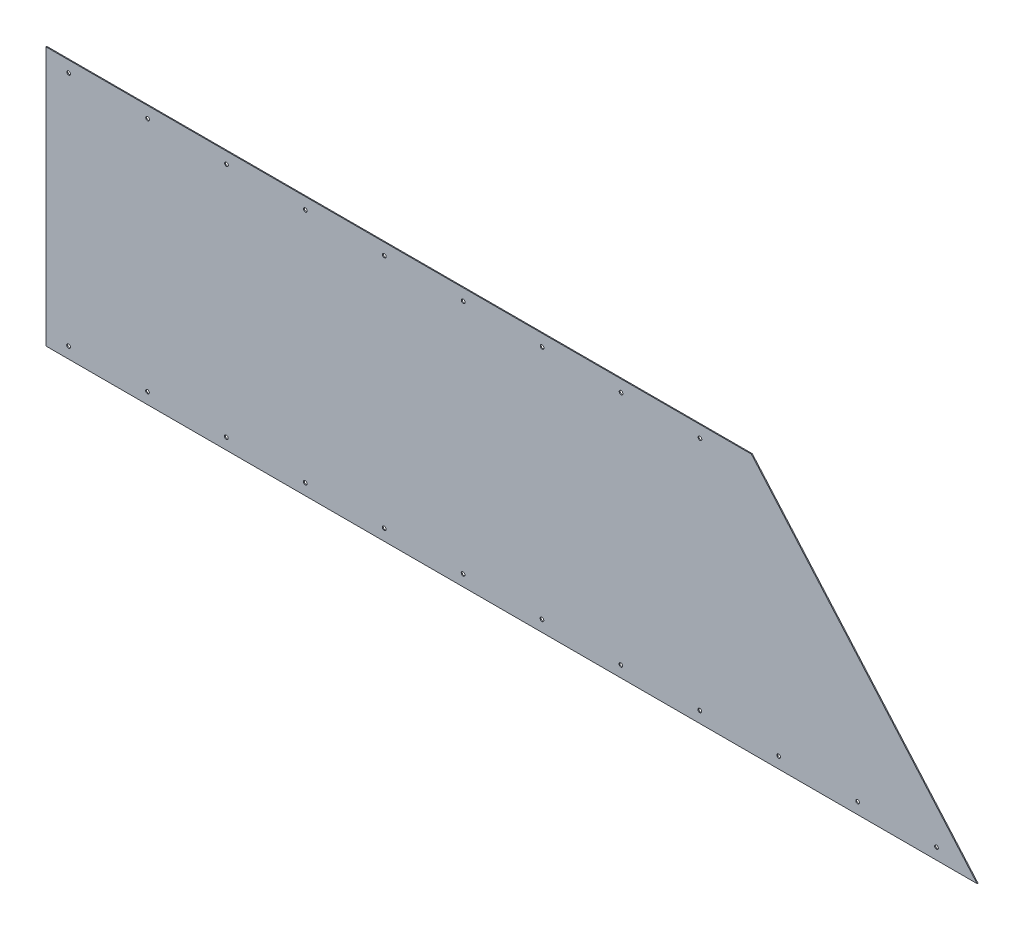
ISO-10303-21;
HEADER;
FILE_DESCRIPTION(('STEP AP214'),'2;1');
FILE_NAME('part.step','',(''),(''),'','','');
FILE_SCHEMA(('AUTOMOTIVE_DESIGN { 1 0 10303 214 1 1 1 1 }'));
ENDSEC;
DATA;
#1=APPLICATION_CONTEXT('core data for automotive mechanical design processes');
#2=APPLICATION_PROTOCOL_DEFINITION('international standard','automotive_design',2000,#1);
#3=PRODUCT_CONTEXT('',#1,'mechanical');
#4=PRODUCT('Part','Part','',(#3));
#5=PRODUCT_RELATED_PRODUCT_CATEGORY('part','',(#4));
#6=PRODUCT_DEFINITION_FORMATION('','',#4);
#7=PRODUCT_DEFINITION_CONTEXT('part definition',#1,'design');
#8=PRODUCT_DEFINITION('design','',#6,#7);
#9=PRODUCT_DEFINITION_SHAPE('','',#8);
#10=(LENGTH_UNIT() NAMED_UNIT(*) SI_UNIT(.MILLI.,.METRE.));
#11=(NAMED_UNIT(*) PLANE_ANGLE_UNIT() SI_UNIT($,.RADIAN.));
#12=(NAMED_UNIT(*) SI_UNIT($,.STERADIAN.) SOLID_ANGLE_UNIT());
#13=UNCERTAINTY_MEASURE_WITH_UNIT(LENGTH_MEASURE(1.E-05),#10,'distance_accuracy_value','');
#14=(GEOMETRIC_REPRESENTATION_CONTEXT(3) GLOBAL_UNCERTAINTY_ASSIGNED_CONTEXT((#13)) GLOBAL_UNIT_ASSIGNED_CONTEXT((#10,
#11,#12)) REPRESENTATION_CONTEXT('',''));
#15=CARTESIAN_POINT('',(0.,0.,0.));
#16=DIRECTION('',(0.,0.,1.));
#17=DIRECTION('',(1.,0.,0.));
#18=AXIS2_PLACEMENT_3D('',#15,#16,#17);
#19=CARTESIAN_POINT('',(-827.22,-229.645,-1.5875));
#20=DIRECTION('',(-1.,0.,0.));
#21=DIRECTION('',(0.,0.,1.));
#22=AXIS2_PLACEMENT_3D('',#19,#20,#21);
#23=PLANE('',#22);
#24=DIRECTION('',(0.,-1.,0.));
#25=VECTOR('',#24,1.);
#26=CARTESIAN_POINT('',(-827.22,-229.645,0.));
#27=LINE('',#26,#25);
#28=CARTESIAN_POINT('',(-827.22,230.125,0.));
#29=VERTEX_POINT('',#28);
#30=CARTESIAN_POINT('',(-827.22,-229.645,0.));
#31=VERTEX_POINT('',#30);
#32=EDGE_CURVE('E105',#29,#31,#27,.T.);
#33=ORIENTED_EDGE('',*,*,#32,.F.);
#34=DIRECTION('',(0.,0.,1.));
#35=VECTOR('',#34,1.);
#36=CARTESIAN_POINT('',(-827.22,230.125,-1.5875));
#37=LINE('',#36,#35);
#38=CARTESIAN_POINT('',(-827.22,230.125,-1.5875));
#39=VERTEX_POINT('',#38);
#40=EDGE_CURVE('E11',#39,#29,#37,.T.);
#41=ORIENTED_EDGE('',*,*,#40,.F.);
#42=DIRECTION('',(0.,-1.,0.));
#43=VECTOR('',#42,1.);
#44=CARTESIAN_POINT('',(-827.22,-229.645,-1.5875));
#45=LINE('',#44,#43);
#46=CARTESIAN_POINT('',(-827.22,-229.645,-1.5875));
#47=VERTEX_POINT('',#46);
#48=EDGE_CURVE('E98',#39,#47,#45,.T.);
#49=ORIENTED_EDGE('',*,*,#48,.T.);
#50=DIRECTION('',(0.,0.,1.));
#51=VECTOR('',#50,1.);
#52=CARTESIAN_POINT('',(-827.22,-229.645,-1.5875));
#53=LINE('',#52,#51);
#54=EDGE_CURVE('E43',#47,#31,#53,.T.);
#55=ORIENTED_EDGE('',*,*,#54,.T.);
#56=EDGE_LOOP('',(#33,#41,#49,#55));
#57=FACE_BOUND('',#56,.T.);
#58=ADVANCED_FACE('F40',(#57),#23,.T.);
#59=CARTESIAN_POINT('',(-827.22,230.125,-1.5875));
#60=DIRECTION('',(0.,1.,0.));
#61=DIRECTION('',(0.,0.,1.));
#62=AXIS2_PLACEMENT_3D('',#59,#60,#61);
#63=PLANE('',#62);
#64=DIRECTION('',(-1.,0.,0.));
#65=VECTOR('',#64,1.);
#66=CARTESIAN_POINT('',(-827.22,230.125,0.));
#67=LINE('',#66,#65);
#68=CARTESIAN_POINT('',(424.28,230.125,0.));
#69=VERTEX_POINT('',#68);
#70=EDGE_CURVE('E100',#69,#29,#67,.T.);
#71=ORIENTED_EDGE('',*,*,#70,.F.);
#72=DIRECTION('',(0.,0.,1.));
#73=VECTOR('',#72,1.);
#74=CARTESIAN_POINT('',(424.28,230.125,-1.5875));
#75=LINE('',#74,#73);
#76=CARTESIAN_POINT('',(424.28,230.125,-1.5875));
#77=VERTEX_POINT('',#76);
#78=EDGE_CURVE('E49',#77,#69,#75,.T.);
#79=ORIENTED_EDGE('',*,*,#78,.F.);
#80=DIRECTION('',(-1.,0.,0.));
#81=VECTOR('',#80,1.);
#82=CARTESIAN_POINT('',(-827.22,230.125,-1.5875));
#83=LINE('',#82,#81);
#84=EDGE_CURVE('E95',#77,#39,#83,.T.);
#85=ORIENTED_EDGE('',*,*,#84,.T.);
#86=ORIENTED_EDGE('',*,*,#40,.T.);
#87=EDGE_LOOP('',(#71,#79,#85,#86));
#88=FACE_BOUND('',#87,.T.);
#89=ADVANCED_FACE('F116',(#88),#63,.T.);
#90=CARTESIAN_POINT('',(424.28,230.125,-1.5875));
#91=DIRECTION('',(0.754036789276716,0.656832185887127,0.));
#92=DIRECTION('',(-0.656832185887127,0.754036789276716,0.));
#93=AXIS2_PLACEMENT_3D('',#90,#91,#92);
#94=PLANE('',#93);
#95=DIRECTION('',(-0.656832185887127,0.754036789276716,0.));
#96=VECTOR('',#95,1.);
#97=CARTESIAN_POINT('',(424.28,230.125,0.));
#98=LINE('',#97,#96);
#99=CARTESIAN_POINT('',(824.78,-229.645,0.));
#100=VERTEX_POINT('',#99);
#101=EDGE_CURVE('E90',#100,#69,#98,.T.);
#102=ORIENTED_EDGE('',*,*,#101,.F.);
#103=DIRECTION('',(0.,0.,1.));
#104=VECTOR('',#103,1.);
#105=CARTESIAN_POINT('',(824.78,-229.645,-1.5875));
#106=LINE('',#105,#104);
#107=CARTESIAN_POINT('',(824.78,-229.645,-1.5875));
#108=VERTEX_POINT('',#107);
#109=EDGE_CURVE('E85',#108,#100,#106,.T.);
#110=ORIENTED_EDGE('',*,*,#109,.F.);
#111=DIRECTION('',(-0.656832185887127,0.754036789276716,0.));
#112=VECTOR('',#111,1.);
#113=CARTESIAN_POINT('',(424.28,230.125,-1.5875));
#114=LINE('',#113,#112);
#115=EDGE_CURVE('E88',#108,#77,#114,.T.);
#116=ORIENTED_EDGE('',*,*,#115,.T.);
#117=ORIENTED_EDGE('',*,*,#78,.T.);
#118=EDGE_LOOP('',(#102,#110,#116,#117));
#119=FACE_BOUND('',#118,.T.);
#120=ADVANCED_FACE('F87',(#119),#94,.T.);
#121=CARTESIAN_POINT('',(-827.22,-229.645,-1.5875));
#122=DIRECTION('',(0.,-1.,0.));
#123=DIRECTION('',(0.,0.,-1.));
#124=AXIS2_PLACEMENT_3D('',#121,#122,#123);
#125=PLANE('',#124);
#126=DIRECTION('',(1.,0.,0.));
#127=VECTOR('',#126,1.);
#128=CARTESIAN_POINT('',(-827.22,-229.645,0.));
#129=LINE('',#128,#127);
#130=EDGE_CURVE('E108',#31,#100,#129,.T.);
#131=ORIENTED_EDGE('',*,*,#130,.F.);
#132=ORIENTED_EDGE('',*,*,#54,.F.);
#133=DIRECTION('',(1.,0.,0.));
#134=VECTOR('',#133,1.);
#135=CARTESIAN_POINT('',(-827.22,-229.645,-1.5875));
#136=LINE('',#135,#134);
#137=EDGE_CURVE('E94',#47,#108,#136,.T.);
#138=ORIENTED_EDGE('',*,*,#137,.T.);
#139=ORIENTED_EDGE('',*,*,#109,.T.);
#140=EDGE_LOOP('',(#131,#132,#138,#139));
#141=FACE_BOUND('',#140,.T.);
#142=ADVANCED_FACE('F97',(#141),#125,.T.);
#143=CARTESIAN_POINT('',(0.,0.,-1.5875));
#144=DIRECTION('',(0.,0.,-1.));
#145=DIRECTION('',(-1.,0.,0.));
#146=AXIS2_PLACEMENT_3D('',#143,#144,#145);
#147=PLANE('',#146);
#148=CARTESIAN_POINT('',(-787.22,-209.645,-1.5875));
#149=DIRECTION('',(0.,0.,-1.));
#150=DIRECTION('',(-1.,0.,0.));
#151=AXIS2_PLACEMENT_3D('',#148,#149,#150);
#152=CIRCLE('',#151,3.29999999999997);
#153=CARTESIAN_POINT('',(-790.52,-209.645,-1.5875));
#154=VERTEX_POINT('',#153);
#155=EDGE_CURVE('E228',#154,#154,#152,.T.);
#156=ORIENTED_EDGE('',*,*,#155,.F.);
#157=EDGE_LOOP('',(#156));
#158=FACE_BOUND('',#157,.T.);
#159=CARTESIAN_POINT('',(-647.22,-209.645000000001,-1.5875));
#160=DIRECTION('',(0.,0.,-1.));
#161=DIRECTION('',(-1.,0.,0.));
#162=AXIS2_PLACEMENT_3D('',#159,#160,#161);
#163=CIRCLE('',#162,3.29999999999997);
#164=CARTESIAN_POINT('',(-650.52,-209.645000000001,-1.5875));
#165=VERTEX_POINT('',#164);
#166=EDGE_CURVE('E230',#165,#165,#163,.T.);
#167=ORIENTED_EDGE('',*,*,#166,.F.);
#168=EDGE_LOOP('',(#167));
#169=FACE_BOUND('',#168,.T.);
#170=CARTESIAN_POINT('',(-507.22,-209.645000000002,-1.5875));
#171=DIRECTION('',(0.,0.,-1.));
#172=DIRECTION('',(-1.,0.,0.));
#173=AXIS2_PLACEMENT_3D('',#170,#171,#172);
#174=CIRCLE('',#173,3.29999999999997);
#175=CARTESIAN_POINT('',(-510.52,-209.645000000002,-1.5875));
#176=VERTEX_POINT('',#175);
#177=EDGE_CURVE('E238',#176,#176,#174,.T.);
#178=ORIENTED_EDGE('',*,*,#177,.F.);
#179=EDGE_LOOP('',(#178));
#180=FACE_BOUND('',#179,.T.);
#181=CARTESIAN_POINT('',(-367.22,-209.645000000003,-1.5875));
#182=DIRECTION('',(0.,0.,-1.));
#183=DIRECTION('',(-1.,0.,0.));
#184=AXIS2_PLACEMENT_3D('',#181,#182,#183);
#185=CIRCLE('',#184,3.29999999999997);
#186=CARTESIAN_POINT('',(-370.52,-209.645000000003,-1.5875));
#187=VERTEX_POINT('',#186);
#188=EDGE_CURVE('E244',#187,#187,#185,.T.);
#189=ORIENTED_EDGE('',*,*,#188,.F.);
#190=EDGE_LOOP('',(#189));
#191=FACE_BOUND('',#190,.T.);
#192=CARTESIAN_POINT('',(-227.22,-209.645000000004,-1.5875));
#193=DIRECTION('',(0.,0.,-1.));
#194=DIRECTION('',(-1.,0.,0.));
#195=AXIS2_PLACEMENT_3D('',#192,#193,#194);
#196=CIRCLE('',#195,3.3);
#197=CARTESIAN_POINT('',(-230.52,-209.645000000004,-1.5875));
#198=VERTEX_POINT('',#197);
#199=EDGE_CURVE('E250',#198,#198,#196,.T.);
#200=ORIENTED_EDGE('',*,*,#199,.F.);
#201=EDGE_LOOP('',(#200));
#202=FACE_BOUND('',#201,.T.);
#203=CARTESIAN_POINT('',(-87.2200000000001,-209.645000000005,-1.5875));
#204=DIRECTION('',(0.,0.,-1.));
#205=DIRECTION('',(-1.,0.,0.));
#206=AXIS2_PLACEMENT_3D('',#203,#204,#205);
#207=CIRCLE('',#206,3.29999999999998);
#208=CARTESIAN_POINT('',(-90.5200000000001,-209.645000000005,-1.5875));
#209=VERTEX_POINT('',#208);
#210=EDGE_CURVE('E256',#209,#209,#207,.T.);
#211=ORIENTED_EDGE('',*,*,#210,.F.);
#212=EDGE_LOOP('',(#211));
#213=FACE_BOUND('',#212,.T.);
#214=CARTESIAN_POINT('',(52.7799999999999,-209.645000000006,-1.5875));
#215=DIRECTION('',(0.,0.,-1.));
#216=DIRECTION('',(-1.,0.,0.));
#217=AXIS2_PLACEMENT_3D('',#214,#215,#216);
#218=CIRCLE('',#217,3.29999999999998);
#219=CARTESIAN_POINT('',(49.48,-209.645000000006,-1.5875));
#220=VERTEX_POINT('',#219);
#221=EDGE_CURVE('E262',#220,#220,#218,.T.);
#222=ORIENTED_EDGE('',*,*,#221,.F.);
#223=EDGE_LOOP('',(#222));
#224=FACE_BOUND('',#223,.T.);
#225=CARTESIAN_POINT('',(192.78,-209.645000000007,-1.5875));
#226=DIRECTION('',(0.,0.,-1.));
#227=DIRECTION('',(-1.,0.,0.));
#228=AXIS2_PLACEMENT_3D('',#225,#226,#227);
#229=CIRCLE('',#228,3.3);
#230=CARTESIAN_POINT('',(189.48,-209.645000000007,-1.5875));
#231=VERTEX_POINT('',#230);
#232=EDGE_CURVE('E268',#231,#231,#229,.T.);
#233=ORIENTED_EDGE('',*,*,#232,.F.);
#234=EDGE_LOOP('',(#233));
#235=FACE_BOUND('',#234,.T.);
#236=CARTESIAN_POINT('',(332.78,-209.645000000008,-1.5875));
#237=DIRECTION('',(0.,0.,-1.));
#238=DIRECTION('',(-1.,0.,0.));
#239=AXIS2_PLACEMENT_3D('',#236,#237,#238);
#240=CIRCLE('',#239,3.29999999999997);
#241=CARTESIAN_POINT('',(329.48,-209.645000000008,-1.5875));
#242=VERTEX_POINT('',#241);
#243=EDGE_CURVE('E274',#242,#242,#240,.T.);
#244=ORIENTED_EDGE('',*,*,#243,.F.);
#245=EDGE_LOOP('',(#244));
#246=FACE_BOUND('',#245,.T.);
#247=CARTESIAN_POINT('',(472.78,-209.645000000009,-1.5875));
#248=DIRECTION('',(0.,0.,-1.));
#249=DIRECTION('',(-1.,0.,0.));
#250=AXIS2_PLACEMENT_3D('',#247,#248,#249);
#251=CIRCLE('',#250,3.29999999999997);
#252=CARTESIAN_POINT('',(469.48,-209.645000000009,-1.5875));
#253=VERTEX_POINT('',#252);
#254=EDGE_CURVE('E280',#253,#253,#251,.T.);
#255=ORIENTED_EDGE('',*,*,#254,.F.);
#256=EDGE_LOOP('',(#255));
#257=FACE_BOUND('',#256,.T.);
#258=CARTESIAN_POINT('',(612.78,-209.64500000001,-1.5875));
#259=DIRECTION('',(0.,0.,-1.));
#260=DIRECTION('',(-1.,0.,0.));
#261=AXIS2_PLACEMENT_3D('',#258,#259,#260);
#262=CIRCLE('',#261,3.29999999999997);
#263=CARTESIAN_POINT('',(609.48,-209.64500000001,-1.5875));
#264=VERTEX_POINT('',#263);
#265=EDGE_CURVE('E286',#264,#264,#262,.T.);
#266=ORIENTED_EDGE('',*,*,#265,.F.);
#267=EDGE_LOOP('',(#266));
#268=FACE_BOUND('',#267,.T.);
#269=CARTESIAN_POINT('',(752.78,-209.645000000011,-1.5875));
#270=DIRECTION('',(0.,0.,-1.));
#271=DIRECTION('',(-1.,0.,0.));
#272=AXIS2_PLACEMENT_3D('',#269,#270,#271);
#273=CIRCLE('',#272,3.29999999999997);
#274=CARTESIAN_POINT('',(749.48,-209.645000000011,-1.5875));
#275=VERTEX_POINT('',#274);
#276=EDGE_CURVE('E292',#275,#275,#273,.T.);
#277=ORIENTED_EDGE('',*,*,#276,.F.);
#278=EDGE_LOOP('',(#277));
#279=FACE_BOUND('',#278,.T.);
#280=CARTESIAN_POINT('',(333.017586504187,208.807629530429,-1.5875));
#281=DIRECTION('',(0.,0.,-1.));
#282=DIRECTION('',(-1.,0.,0.));
#283=AXIS2_PLACEMENT_3D('',#280,#281,#282);
#284=CIRCLE('',#283,3.29999999999997);
#285=CARTESIAN_POINT('',(329.717586504187,208.807629530429,-1.5875));
#286=VERTEX_POINT('',#285);
#287=EDGE_CURVE('E298',#286,#286,#284,.T.);
#288=ORIENTED_EDGE('',*,*,#287,.F.);
#289=EDGE_LOOP('',(#288));
#290=FACE_BOUND('',#289,.T.);
#291=CARTESIAN_POINT('',(193.017676766992,208.966606186404,-1.5875));
#292=DIRECTION('',(0.,0.,-1.));
#293=DIRECTION('',(-1.,0.,0.));
#294=AXIS2_PLACEMENT_3D('',#291,#292,#293);
#295=CIRCLE('',#294,3.3);
#296=CARTESIAN_POINT('',(189.717676766992,208.966606186404,-1.5875));
#297=VERTEX_POINT('',#296);
#298=EDGE_CURVE('E304',#297,#297,#295,.T.);
#299=ORIENTED_EDGE('',*,*,#298,.F.);
#300=EDGE_LOOP('',(#299));
#301=FACE_BOUND('',#300,.T.);
#302=CARTESIAN_POINT('',(53.0177670297963,209.12558284238,-1.5875));
#303=DIRECTION('',(0.,0.,-1.));
#304=DIRECTION('',(-1.,0.,0.));
#305=AXIS2_PLACEMENT_3D('',#302,#303,#304);
#306=CIRCLE('',#305,3.29999999999999);
#307=CARTESIAN_POINT('',(49.7177670297963,209.12558284238,-1.5875));
#308=VERTEX_POINT('',#307);
#309=EDGE_CURVE('E310',#308,#308,#306,.T.);
#310=ORIENTED_EDGE('',*,*,#309,.F.);
#311=EDGE_LOOP('',(#310));
#312=FACE_BOUND('',#311,.T.);
#313=CARTESIAN_POINT('',(-86.9821427073991,209.284559498355,-1.5875));
#314=DIRECTION('',(0.,0.,-1.));
#315=DIRECTION('',(-1.,0.,0.));
#316=AXIS2_PLACEMENT_3D('',#313,#314,#315);
#317=CIRCLE('',#316,3.29999999999998);
#318=CARTESIAN_POINT('',(-90.2821427073991,209.284559498355,-1.5875));
#319=VERTEX_POINT('',#318);
#320=EDGE_CURVE('E316',#319,#319,#317,.T.);
#321=ORIENTED_EDGE('',*,*,#320,.F.);
#322=EDGE_LOOP('',(#321));
#323=FACE_BOUND('',#322,.T.);
#324=CARTESIAN_POINT('',(-226.982052444595,209.44353615433,-1.5875));
#325=DIRECTION('',(0.,0.,-1.));
#326=DIRECTION('',(-1.,0.,0.));
#327=AXIS2_PLACEMENT_3D('',#324,#325,#326);
#328=CIRCLE('',#327,3.3);
#329=CARTESIAN_POINT('',(-230.282052444595,209.44353615433,-1.5875));
#330=VERTEX_POINT('',#329);
#331=EDGE_CURVE('E322',#330,#330,#328,.T.);
#332=ORIENTED_EDGE('',*,*,#331,.F.);
#333=EDGE_LOOP('',(#332));
#334=FACE_BOUND('',#333,.T.);
#335=CARTESIAN_POINT('',(-366.98196218179,209.602512810305,-1.5875));
#336=DIRECTION('',(0.,0.,-1.));
#337=DIRECTION('',(-1.,0.,0.));
#338=AXIS2_PLACEMENT_3D('',#335,#336,#337);
#339=CIRCLE('',#338,3.29999999999997);
#340=CARTESIAN_POINT('',(-370.28196218179,209.602512810305,-1.5875));
#341=VERTEX_POINT('',#340);
#342=EDGE_CURVE('E328',#341,#341,#339,.T.);
#343=ORIENTED_EDGE('',*,*,#342,.F.);
#344=EDGE_LOOP('',(#343));
#345=FACE_BOUND('',#344,.T.);
#346=CARTESIAN_POINT('',(-506.981871918985,209.76148946628,-1.5875));
#347=DIRECTION('',(0.,0.,-1.));
#348=DIRECTION('',(-1.,0.,0.));
#349=AXIS2_PLACEMENT_3D('',#346,#347,#348);
#350=CIRCLE('',#349,3.29999999999997);
#351=CARTESIAN_POINT('',(-510.281871918985,209.76148946628,-1.5875));
#352=VERTEX_POINT('',#351);
#353=EDGE_CURVE('E334',#352,#352,#350,.T.);
#354=ORIENTED_EDGE('',*,*,#353,.F.);
#355=EDGE_LOOP('',(#354));
#356=FACE_BOUND('',#355,.T.);
#357=CARTESIAN_POINT('',(-646.981781656181,209.920466122255,-1.5875));
#358=DIRECTION('',(0.,0.,-1.));
#359=DIRECTION('',(-1.,0.,0.));
#360=AXIS2_PLACEMENT_3D('',#357,#358,#359);
#361=CIRCLE('',#360,3.29999999999997);
#362=CARTESIAN_POINT('',(-650.281781656181,209.920466122255,-1.5875));
#363=VERTEX_POINT('',#362);
#364=EDGE_CURVE('E340',#363,#363,#361,.T.);
#365=ORIENTED_EDGE('',*,*,#364,.F.);
#366=EDGE_LOOP('',(#365));
#367=FACE_BOUND('',#366,.T.);
#368=CARTESIAN_POINT('',(-786.981691393376,210.07944277823,-1.5875));
#369=DIRECTION('',(0.,0.,-1.));
#370=DIRECTION('',(-1.,0.,0.));
#371=AXIS2_PLACEMENT_3D('',#368,#369,#370);
#372=CIRCLE('',#371,3.29999999999997);
#373=CARTESIAN_POINT('',(-790.281691393376,210.07944277823,-1.5875));
#374=VERTEX_POINT('',#373);
#375=EDGE_CURVE('E346',#374,#374,#372,.T.);
#376=ORIENTED_EDGE('',*,*,#375,.F.);
#377=EDGE_LOOP('',(#376));
#378=FACE_BOUND('',#377,.T.);
#379=ORIENTED_EDGE('',*,*,#48,.F.);
#380=ORIENTED_EDGE('',*,*,#84,.F.);
#381=ORIENTED_EDGE('',*,*,#115,.F.);
#382=ORIENTED_EDGE('',*,*,#137,.F.);
#383=EDGE_LOOP('',(#379,#380,#381,#382));
#384=FACE_BOUND('',#383,.T.);
#385=ADVANCED_FACE('F93',(#158,#169,#180,#191,#202,#213,#224,#235,#246,#257,#268,#279,#290,#301,
#312,#323,#334,#345,#356,#367,#378,#384),#147,.T.);
#386=CARTESIAN_POINT('',(0.,0.,0.));
#387=DIRECTION('',(0.,0.,-1.));
#388=DIRECTION('',(-1.,0.,0.));
#389=AXIS2_PLACEMENT_3D('',#386,#387,#388);
#390=PLANE('',#389);
#391=CARTESIAN_POINT('',(-787.22,-209.645,0.));
#392=DIRECTION('',(0.,0.,-1.));
#393=DIRECTION('',(-1.,0.,0.));
#394=AXIS2_PLACEMENT_3D('',#391,#392,#393);
#395=CIRCLE('',#394,3.29999999999997);
#396=CARTESIAN_POINT('',(-790.52,-209.645,0.));
#397=VERTEX_POINT('',#396);
#398=EDGE_CURVE('E226',#397,#397,#395,.T.);
#399=ORIENTED_EDGE('',*,*,#398,.T.);
#400=EDGE_LOOP('',(#399));
#401=FACE_BOUND('',#400,.T.);
#402=CARTESIAN_POINT('',(-647.22,-209.645000000001,0.));
#403=DIRECTION('',(0.,0.,-1.));
#404=DIRECTION('',(-1.,0.,0.));
#405=AXIS2_PLACEMENT_3D('',#402,#403,#404);
#406=CIRCLE('',#405,3.29999999999997);
#407=CARTESIAN_POINT('',(-650.52,-209.645000000001,0.));
#408=VERTEX_POINT('',#407);
#409=EDGE_CURVE('E235',#408,#408,#406,.T.);
#410=ORIENTED_EDGE('',*,*,#409,.T.);
#411=EDGE_LOOP('',(#410));
#412=FACE_BOUND('',#411,.T.);
#413=CARTESIAN_POINT('',(-507.22,-209.645000000002,0.));
#414=DIRECTION('',(0.,0.,-1.));
#415=DIRECTION('',(-1.,0.,0.));
#416=AXIS2_PLACEMENT_3D('',#413,#414,#415);
#417=CIRCLE('',#416,3.29999999999997);
#418=CARTESIAN_POINT('',(-510.52,-209.645000000002,0.));
#419=VERTEX_POINT('',#418);
#420=EDGE_CURVE('E241',#419,#419,#417,.T.);
#421=ORIENTED_EDGE('',*,*,#420,.T.);
#422=EDGE_LOOP('',(#421));
#423=FACE_BOUND('',#422,.T.);
#424=CARTESIAN_POINT('',(-367.22,-209.645000000003,0.));
#425=DIRECTION('',(0.,0.,-1.));
#426=DIRECTION('',(-1.,0.,0.));
#427=AXIS2_PLACEMENT_3D('',#424,#425,#426);
#428=CIRCLE('',#427,3.30000000000003);
#429=CARTESIAN_POINT('',(-370.52,-209.645000000003,0.));
#430=VERTEX_POINT('',#429);
#431=EDGE_CURVE('E247',#430,#430,#428,.T.);
#432=ORIENTED_EDGE('',*,*,#431,.T.);
#433=EDGE_LOOP('',(#432));
#434=FACE_BOUND('',#433,.T.);
#435=CARTESIAN_POINT('',(-227.22,-209.645000000004,0.));
#436=DIRECTION('',(0.,0.,-1.));
#437=DIRECTION('',(-1.,0.,0.));
#438=AXIS2_PLACEMENT_3D('',#435,#436,#437);
#439=CIRCLE('',#438,3.3);
#440=CARTESIAN_POINT('',(-230.52,-209.645000000004,0.));
#441=VERTEX_POINT('',#440);
#442=EDGE_CURVE('E253',#441,#441,#439,.T.);
#443=ORIENTED_EDGE('',*,*,#442,.T.);
#444=EDGE_LOOP('',(#443));
#445=FACE_BOUND('',#444,.T.);
#446=CARTESIAN_POINT('',(-87.2200000000001,-209.645000000005,0.));
#447=DIRECTION('',(0.,0.,-1.));
#448=DIRECTION('',(-1.,0.,0.));
#449=AXIS2_PLACEMENT_3D('',#446,#447,#448);
#450=CIRCLE('',#449,3.3);
#451=CARTESIAN_POINT('',(-90.5200000000001,-209.645000000005,0.));
#452=VERTEX_POINT('',#451);
#453=EDGE_CURVE('E259',#452,#452,#450,.T.);
#454=ORIENTED_EDGE('',*,*,#453,.T.);
#455=EDGE_LOOP('',(#454));
#456=FACE_BOUND('',#455,.T.);
#457=CARTESIAN_POINT('',(52.7799999999999,-209.645000000006,0.));
#458=DIRECTION('',(0.,0.,-1.));
#459=DIRECTION('',(-1.,0.,0.));
#460=AXIS2_PLACEMENT_3D('',#457,#458,#459);
#461=CIRCLE('',#460,3.3);
#462=CARTESIAN_POINT('',(49.4799999999999,-209.645000000006,0.));
#463=VERTEX_POINT('',#462);
#464=EDGE_CURVE('E265',#463,#463,#461,.T.);
#465=ORIENTED_EDGE('',*,*,#464,.T.);
#466=EDGE_LOOP('',(#465));
#467=FACE_BOUND('',#466,.T.);
#468=CARTESIAN_POINT('',(192.78,-209.645000000007,0.));
#469=DIRECTION('',(0.,0.,-1.));
#470=DIRECTION('',(-1.,0.,0.));
#471=AXIS2_PLACEMENT_3D('',#468,#469,#470);
#472=CIRCLE('',#471,3.3);
#473=CARTESIAN_POINT('',(189.48,-209.645000000007,0.));
#474=VERTEX_POINT('',#473);
#475=EDGE_CURVE('E271',#474,#474,#472,.T.);
#476=ORIENTED_EDGE('',*,*,#475,.T.);
#477=EDGE_LOOP('',(#476));
#478=FACE_BOUND('',#477,.T.);
#479=CARTESIAN_POINT('',(332.78,-209.645000000008,0.));
#480=DIRECTION('',(0.,0.,-1.));
#481=DIRECTION('',(-1.,0.,0.));
#482=AXIS2_PLACEMENT_3D('',#479,#480,#481);
#483=CIRCLE('',#482,3.30000000000003);
#484=CARTESIAN_POINT('',(329.48,-209.645000000008,0.));
#485=VERTEX_POINT('',#484);
#486=EDGE_CURVE('E277',#485,#485,#483,.T.);
#487=ORIENTED_EDGE('',*,*,#486,.T.);
#488=EDGE_LOOP('',(#487));
#489=FACE_BOUND('',#488,.T.);
#490=CARTESIAN_POINT('',(472.78,-209.645000000009,0.));
#491=DIRECTION('',(0.,0.,-1.));
#492=DIRECTION('',(-1.,0.,0.));
#493=AXIS2_PLACEMENT_3D('',#490,#491,#492);
#494=CIRCLE('',#493,3.30000000000003);
#495=CARTESIAN_POINT('',(469.48,-209.645000000009,0.));
#496=VERTEX_POINT('',#495);
#497=EDGE_CURVE('E283',#496,#496,#494,.T.);
#498=ORIENTED_EDGE('',*,*,#497,.T.);
#499=EDGE_LOOP('',(#498));
#500=FACE_BOUND('',#499,.T.);
#501=CARTESIAN_POINT('',(612.78,-209.64500000001,0.));
#502=DIRECTION('',(0.,0.,-1.));
#503=DIRECTION('',(-1.,0.,0.));
#504=AXIS2_PLACEMENT_3D('',#501,#502,#503);
#505=CIRCLE('',#504,3.29999999999997);
#506=CARTESIAN_POINT('',(609.48,-209.64500000001,0.));
#507=VERTEX_POINT('',#506);
#508=EDGE_CURVE('E289',#507,#507,#505,.T.);
#509=ORIENTED_EDGE('',*,*,#508,.T.);
#510=EDGE_LOOP('',(#509));
#511=FACE_BOUND('',#510,.T.);
#512=CARTESIAN_POINT('',(752.78,-209.645000000011,0.));
#513=DIRECTION('',(0.,0.,-1.));
#514=DIRECTION('',(-1.,0.,0.));
#515=AXIS2_PLACEMENT_3D('',#512,#513,#514);
#516=CIRCLE('',#515,3.29999999999997);
#517=CARTESIAN_POINT('',(749.48,-209.645000000011,0.));
#518=VERTEX_POINT('',#517);
#519=EDGE_CURVE('E295',#518,#518,#516,.T.);
#520=ORIENTED_EDGE('',*,*,#519,.T.);
#521=EDGE_LOOP('',(#520));
#522=FACE_BOUND('',#521,.T.);
#523=CARTESIAN_POINT('',(333.017586504187,208.807629530429,0.));
#524=DIRECTION('',(0.,0.,-1.));
#525=DIRECTION('',(-1.,0.,0.));
#526=AXIS2_PLACEMENT_3D('',#523,#524,#525);
#527=CIRCLE('',#526,3.30000000000003);
#528=CARTESIAN_POINT('',(329.717586504187,208.807629530429,0.));
#529=VERTEX_POINT('',#528);
#530=EDGE_CURVE('E301',#529,#529,#527,.T.);
#531=ORIENTED_EDGE('',*,*,#530,.T.);
#532=EDGE_LOOP('',(#531));
#533=FACE_BOUND('',#532,.T.);
#534=CARTESIAN_POINT('',(193.017676766992,208.966606186404,0.));
#535=DIRECTION('',(0.,0.,-1.));
#536=DIRECTION('',(-1.,0.,0.));
#537=AXIS2_PLACEMENT_3D('',#534,#535,#536);
#538=CIRCLE('',#537,3.3);
#539=CARTESIAN_POINT('',(189.717676766992,208.966606186404,0.));
#540=VERTEX_POINT('',#539);
#541=EDGE_CURVE('E307',#540,#540,#538,.T.);
#542=ORIENTED_EDGE('',*,*,#541,.T.);
#543=EDGE_LOOP('',(#542));
#544=FACE_BOUND('',#543,.T.);
#545=CARTESIAN_POINT('',(53.0177670297963,209.12558284238,0.));
#546=DIRECTION('',(0.,0.,-1.));
#547=DIRECTION('',(-1.,0.,0.));
#548=AXIS2_PLACEMENT_3D('',#545,#546,#547);
#549=CIRCLE('',#548,3.3);
#550=CARTESIAN_POINT('',(49.7177670297963,209.12558284238,0.));
#551=VERTEX_POINT('',#550);
#552=EDGE_CURVE('E313',#551,#551,#549,.T.);
#553=ORIENTED_EDGE('',*,*,#552,.T.);
#554=EDGE_LOOP('',(#553));
#555=FACE_BOUND('',#554,.T.);
#556=CARTESIAN_POINT('',(-86.9821427073991,209.284559498355,0.));
#557=DIRECTION('',(0.,0.,-1.));
#558=DIRECTION('',(-1.,0.,0.));
#559=AXIS2_PLACEMENT_3D('',#556,#557,#558);
#560=CIRCLE('',#559,3.3);
#561=CARTESIAN_POINT('',(-90.2821427073991,209.284559498355,0.));
#562=VERTEX_POINT('',#561);
#563=EDGE_CURVE('E319',#562,#562,#560,.T.);
#564=ORIENTED_EDGE('',*,*,#563,.T.);
#565=EDGE_LOOP('',(#564));
#566=FACE_BOUND('',#565,.T.);
#567=CARTESIAN_POINT('',(-226.982052444595,209.44353615433,0.));
#568=DIRECTION('',(0.,0.,-1.));
#569=DIRECTION('',(-1.,0.,0.));
#570=AXIS2_PLACEMENT_3D('',#567,#568,#569);
#571=CIRCLE('',#570,3.3);
#572=CARTESIAN_POINT('',(-230.282052444595,209.44353615433,0.));
#573=VERTEX_POINT('',#572);
#574=EDGE_CURVE('E325',#573,#573,#571,.T.);
#575=ORIENTED_EDGE('',*,*,#574,.T.);
#576=EDGE_LOOP('',(#575));
#577=FACE_BOUND('',#576,.T.);
#578=CARTESIAN_POINT('',(-366.98196218179,209.602512810305,0.));
#579=DIRECTION('',(0.,0.,-1.));
#580=DIRECTION('',(-1.,0.,0.));
#581=AXIS2_PLACEMENT_3D('',#578,#579,#580);
#582=CIRCLE('',#581,3.30000000000003);
#583=CARTESIAN_POINT('',(-370.28196218179,209.602512810305,0.));
#584=VERTEX_POINT('',#583);
#585=EDGE_CURVE('E331',#584,#584,#582,.T.);
#586=ORIENTED_EDGE('',*,*,#585,.T.);
#587=EDGE_LOOP('',(#586));
#588=FACE_BOUND('',#587,.T.);
#589=CARTESIAN_POINT('',(-506.981871918985,209.76148946628,0.));
#590=DIRECTION('',(0.,0.,-1.));
#591=DIRECTION('',(-1.,0.,0.));
#592=AXIS2_PLACEMENT_3D('',#589,#590,#591);
#593=CIRCLE('',#592,3.29999999999997);
#594=CARTESIAN_POINT('',(-510.281871918985,209.76148946628,0.));
#595=VERTEX_POINT('',#594);
#596=EDGE_CURVE('E337',#595,#595,#593,.T.);
#597=ORIENTED_EDGE('',*,*,#596,.T.);
#598=EDGE_LOOP('',(#597));
#599=FACE_BOUND('',#598,.T.);
#600=CARTESIAN_POINT('',(-646.981781656181,209.920466122255,0.));
#601=DIRECTION('',(0.,0.,-1.));
#602=DIRECTION('',(-1.,0.,0.));
#603=AXIS2_PLACEMENT_3D('',#600,#601,#602);
#604=CIRCLE('',#603,3.29999999999997);
#605=CARTESIAN_POINT('',(-650.281781656181,209.920466122255,0.));
#606=VERTEX_POINT('',#605);
#607=EDGE_CURVE('E343',#606,#606,#604,.T.);
#608=ORIENTED_EDGE('',*,*,#607,.T.);
#609=EDGE_LOOP('',(#608));
#610=FACE_BOUND('',#609,.T.);
#611=CARTESIAN_POINT('',(-786.981691393376,210.07944277823,0.));
#612=DIRECTION('',(0.,0.,-1.));
#613=DIRECTION('',(-1.,0.,0.));
#614=AXIS2_PLACEMENT_3D('',#611,#612,#613);
#615=CIRCLE('',#614,3.29999999999997);
#616=CARTESIAN_POINT('',(-790.281691393376,210.07944277823,0.));
#617=VERTEX_POINT('',#616);
#618=EDGE_CURVE('E109',#617,#617,#615,.T.);
#619=ORIENTED_EDGE('',*,*,#618,.T.);
#620=EDGE_LOOP('',(#619));
#621=FACE_BOUND('',#620,.T.);
#622=ORIENTED_EDGE('',*,*,#32,.T.);
#623=ORIENTED_EDGE('',*,*,#130,.T.);
#624=ORIENTED_EDGE('',*,*,#101,.T.);
#625=ORIENTED_EDGE('',*,*,#70,.T.);
#626=EDGE_LOOP('',(#622,#623,#624,#625));
#627=FACE_BOUND('',#626,.T.);
#628=ADVANCED_FACE('F115',(#401,#412,#423,#434,#445,#456,#467,#478,#489,#500,#511,#522,#533,
#544,#555,#566,#577,#588,#599,#610,#621,#627),#390,.F.);
#629=CARTESIAN_POINT('',(-786.981691393376,210.07944277823,-1.5875));
#630=DIRECTION('',(0.,0.,-1.));
#631=DIRECTION('',(-1.,0.,0.));
#632=AXIS2_PLACEMENT_3D('',#629,#630,#631);
#633=CYLINDRICAL_SURFACE('',#632,3.29999999999997);
#634=ORIENTED_EDGE('',*,*,#618,.F.);
#635=EDGE_LOOP('',(#634));
#636=FACE_BOUND('',#635,.T.);
#637=ORIENTED_EDGE('',*,*,#375,.T.);
#638=EDGE_LOOP('',(#637));
#639=FACE_BOUND('',#638,.T.);
#640=ADVANCED_FACE('F134',(#636,#639),#633,.F.);
#641=CARTESIAN_POINT('',(-646.981781656181,209.920466122255,-1.5875));
#642=DIRECTION('',(0.,0.,-1.));
#643=DIRECTION('',(-1.,0.,0.));
#644=AXIS2_PLACEMENT_3D('',#641,#642,#643);
#645=CYLINDRICAL_SURFACE('',#644,3.29999999999997);
#646=ORIENTED_EDGE('',*,*,#607,.F.);
#647=EDGE_LOOP('',(#646));
#648=FACE_BOUND('',#647,.T.);
#649=ORIENTED_EDGE('',*,*,#364,.T.);
#650=EDGE_LOOP('',(#649));
#651=FACE_BOUND('',#650,.T.);
#652=ADVANCED_FACE('F141',(#648,#651),#645,.F.);
#653=CARTESIAN_POINT('',(-506.981871918985,209.76148946628,-1.5875));
#654=DIRECTION('',(0.,0.,-1.));
#655=DIRECTION('',(-1.,0.,0.));
#656=AXIS2_PLACEMENT_3D('',#653,#654,#655);
#657=CYLINDRICAL_SURFACE('',#656,3.29999999999997);
#658=ORIENTED_EDGE('',*,*,#596,.F.);
#659=EDGE_LOOP('',(#658));
#660=FACE_BOUND('',#659,.T.);
#661=ORIENTED_EDGE('',*,*,#353,.T.);
#662=EDGE_LOOP('',(#661));
#663=FACE_BOUND('',#662,.T.);
#664=ADVANCED_FACE('F145',(#660,#663),#657,.F.);
#665=CARTESIAN_POINT('',(-366.98196218179,209.602512810305,-1.5875));
#666=DIRECTION('',(0.,0.,-1.));
#667=DIRECTION('',(-1.,0.,0.));
#668=AXIS2_PLACEMENT_3D('',#665,#666,#667);
#669=CYLINDRICAL_SURFACE('',#668,3.3);
#670=ORIENTED_EDGE('',*,*,#585,.F.);
#671=EDGE_LOOP('',(#670));
#672=FACE_BOUND('',#671,.T.);
#673=ORIENTED_EDGE('',*,*,#342,.T.);
#674=EDGE_LOOP('',(#673));
#675=FACE_BOUND('',#674,.T.);
#676=ADVANCED_FACE('F149',(#672,#675),#669,.F.);
#677=CARTESIAN_POINT('',(-226.982052444595,209.44353615433,-1.5875));
#678=DIRECTION('',(0.,0.,-1.));
#679=DIRECTION('',(-1.,0.,0.));
#680=AXIS2_PLACEMENT_3D('',#677,#678,#679);
#681=CYLINDRICAL_SURFACE('',#680,3.3);
#682=ORIENTED_EDGE('',*,*,#574,.F.);
#683=EDGE_LOOP('',(#682));
#684=FACE_BOUND('',#683,.T.);
#685=ORIENTED_EDGE('',*,*,#331,.T.);
#686=EDGE_LOOP('',(#685));
#687=FACE_BOUND('',#686,.T.);
#688=ADVANCED_FACE('F153',(#684,#687),#681,.F.);
#689=CARTESIAN_POINT('',(-86.9821427073991,209.284559498355,-1.5875));
#690=DIRECTION('',(0.,0.,-1.));
#691=DIRECTION('',(-1.,0.,0.));
#692=AXIS2_PLACEMENT_3D('',#689,#690,#691);
#693=CYLINDRICAL_SURFACE('',#692,3.29999999999999);
#694=ORIENTED_EDGE('',*,*,#563,.F.);
#695=EDGE_LOOP('',(#694));
#696=FACE_BOUND('',#695,.T.);
#697=ORIENTED_EDGE('',*,*,#320,.T.);
#698=EDGE_LOOP('',(#697));
#699=FACE_BOUND('',#698,.T.);
#700=ADVANCED_FACE('F157',(#696,#699),#693,.F.);
#701=CARTESIAN_POINT('',(53.0177670297963,209.12558284238,-1.5875));
#702=DIRECTION('',(0.,0.,-1.));
#703=DIRECTION('',(-1.,0.,0.));
#704=AXIS2_PLACEMENT_3D('',#701,#702,#703);
#705=CYLINDRICAL_SURFACE('',#704,3.29999999999999);
#706=ORIENTED_EDGE('',*,*,#552,.F.);
#707=EDGE_LOOP('',(#706));
#708=FACE_BOUND('',#707,.T.);
#709=ORIENTED_EDGE('',*,*,#309,.T.);
#710=EDGE_LOOP('',(#709));
#711=FACE_BOUND('',#710,.T.);
#712=ADVANCED_FACE('F161',(#708,#711),#705,.F.);
#713=CARTESIAN_POINT('',(193.017676766992,208.966606186404,-1.5875));
#714=DIRECTION('',(0.,0.,-1.));
#715=DIRECTION('',(-1.,0.,0.));
#716=AXIS2_PLACEMENT_3D('',#713,#714,#715);
#717=CYLINDRICAL_SURFACE('',#716,3.3);
#718=ORIENTED_EDGE('',*,*,#541,.F.);
#719=EDGE_LOOP('',(#718));
#720=FACE_BOUND('',#719,.T.);
#721=ORIENTED_EDGE('',*,*,#298,.T.);
#722=EDGE_LOOP('',(#721));
#723=FACE_BOUND('',#722,.T.);
#724=ADVANCED_FACE('F165',(#720,#723),#717,.F.);
#725=CARTESIAN_POINT('',(333.017586504187,208.807629530429,-1.5875));
#726=DIRECTION('',(0.,0.,-1.));
#727=DIRECTION('',(-1.,0.,0.));
#728=AXIS2_PLACEMENT_3D('',#725,#726,#727);
#729=CYLINDRICAL_SURFACE('',#728,3.3);
#730=ORIENTED_EDGE('',*,*,#530,.F.);
#731=EDGE_LOOP('',(#730));
#732=FACE_BOUND('',#731,.T.);
#733=ORIENTED_EDGE('',*,*,#287,.T.);
#734=EDGE_LOOP('',(#733));
#735=FACE_BOUND('',#734,.T.);
#736=ADVANCED_FACE('F169',(#732,#735),#729,.F.);
#737=CARTESIAN_POINT('',(752.78,-209.645000000011,-1.5875));
#738=DIRECTION('',(0.,0.,-1.));
#739=DIRECTION('',(-1.,0.,0.));
#740=AXIS2_PLACEMENT_3D('',#737,#738,#739);
#741=CYLINDRICAL_SURFACE('',#740,3.29999999999997);
#742=ORIENTED_EDGE('',*,*,#519,.F.);
#743=EDGE_LOOP('',(#742));
#744=FACE_BOUND('',#743,.T.);
#745=ORIENTED_EDGE('',*,*,#276,.T.);
#746=EDGE_LOOP('',(#745));
#747=FACE_BOUND('',#746,.T.);
#748=ADVANCED_FACE('F173',(#744,#747),#741,.F.);
#749=CARTESIAN_POINT('',(612.78,-209.64500000001,-1.5875));
#750=DIRECTION('',(0.,0.,-1.));
#751=DIRECTION('',(-1.,0.,0.));
#752=AXIS2_PLACEMENT_3D('',#749,#750,#751);
#753=CYLINDRICAL_SURFACE('',#752,3.29999999999997);
#754=ORIENTED_EDGE('',*,*,#508,.F.);
#755=EDGE_LOOP('',(#754));
#756=FACE_BOUND('',#755,.T.);
#757=ORIENTED_EDGE('',*,*,#265,.T.);
#758=EDGE_LOOP('',(#757));
#759=FACE_BOUND('',#758,.T.);
#760=ADVANCED_FACE('F177',(#756,#759),#753,.F.);
#761=CARTESIAN_POINT('',(472.78,-209.645000000009,-1.5875));
#762=DIRECTION('',(0.,0.,-1.));
#763=DIRECTION('',(-1.,0.,0.));
#764=AXIS2_PLACEMENT_3D('',#761,#762,#763);
#765=CYLINDRICAL_SURFACE('',#764,3.3);
#766=ORIENTED_EDGE('',*,*,#497,.F.);
#767=EDGE_LOOP('',(#766));
#768=FACE_BOUND('',#767,.T.);
#769=ORIENTED_EDGE('',*,*,#254,.T.);
#770=EDGE_LOOP('',(#769));
#771=FACE_BOUND('',#770,.T.);
#772=ADVANCED_FACE('F181',(#768,#771),#765,.F.);
#773=CARTESIAN_POINT('',(332.78,-209.645000000008,-1.5875));
#774=DIRECTION('',(0.,0.,-1.));
#775=DIRECTION('',(-1.,0.,0.));
#776=AXIS2_PLACEMENT_3D('',#773,#774,#775);
#777=CYLINDRICAL_SURFACE('',#776,3.3);
#778=ORIENTED_EDGE('',*,*,#486,.F.);
#779=EDGE_LOOP('',(#778));
#780=FACE_BOUND('',#779,.T.);
#781=ORIENTED_EDGE('',*,*,#243,.T.);
#782=EDGE_LOOP('',(#781));
#783=FACE_BOUND('',#782,.T.);
#784=ADVANCED_FACE('F185',(#780,#783),#777,.F.);
#785=CARTESIAN_POINT('',(192.78,-209.645000000007,-1.5875));
#786=DIRECTION('',(0.,0.,-1.));
#787=DIRECTION('',(-1.,0.,0.));
#788=AXIS2_PLACEMENT_3D('',#785,#786,#787);
#789=CYLINDRICAL_SURFACE('',#788,3.3);
#790=ORIENTED_EDGE('',*,*,#475,.F.);
#791=EDGE_LOOP('',(#790));
#792=FACE_BOUND('',#791,.T.);
#793=ORIENTED_EDGE('',*,*,#232,.T.);
#794=EDGE_LOOP('',(#793));
#795=FACE_BOUND('',#794,.T.);
#796=ADVANCED_FACE('F189',(#792,#795),#789,.F.);
#797=CARTESIAN_POINT('',(52.7799999999999,-209.645000000006,-1.5875));
#798=DIRECTION('',(0.,0.,-1.));
#799=DIRECTION('',(-1.,0.,0.));
#800=AXIS2_PLACEMENT_3D('',#797,#798,#799);
#801=CYLINDRICAL_SURFACE('',#800,3.29999999999999);
#802=ORIENTED_EDGE('',*,*,#464,.F.);
#803=EDGE_LOOP('',(#802));
#804=FACE_BOUND('',#803,.T.);
#805=ORIENTED_EDGE('',*,*,#221,.T.);
#806=EDGE_LOOP('',(#805));
#807=FACE_BOUND('',#806,.T.);
#808=ADVANCED_FACE('F193',(#804,#807),#801,.F.);
#809=CARTESIAN_POINT('',(-87.2200000000001,-209.645000000005,-1.5875));
#810=DIRECTION('',(0.,0.,-1.));
#811=DIRECTION('',(-1.,0.,0.));
#812=AXIS2_PLACEMENT_3D('',#809,#810,#811);
#813=CYLINDRICAL_SURFACE('',#812,3.29999999999999);
#814=ORIENTED_EDGE('',*,*,#453,.F.);
#815=EDGE_LOOP('',(#814));
#816=FACE_BOUND('',#815,.T.);
#817=ORIENTED_EDGE('',*,*,#210,.T.);
#818=EDGE_LOOP('',(#817));
#819=FACE_BOUND('',#818,.T.);
#820=ADVANCED_FACE('F197',(#816,#819),#813,.F.);
#821=CARTESIAN_POINT('',(-227.22,-209.645000000004,-1.5875));
#822=DIRECTION('',(0.,0.,-1.));
#823=DIRECTION('',(-1.,0.,0.));
#824=AXIS2_PLACEMENT_3D('',#821,#822,#823);
#825=CYLINDRICAL_SURFACE('',#824,3.3);
#826=ORIENTED_EDGE('',*,*,#442,.F.);
#827=EDGE_LOOP('',(#826));
#828=FACE_BOUND('',#827,.T.);
#829=ORIENTED_EDGE('',*,*,#199,.T.);
#830=EDGE_LOOP('',(#829));
#831=FACE_BOUND('',#830,.T.);
#832=ADVANCED_FACE('F201',(#828,#831),#825,.F.);
#833=CARTESIAN_POINT('',(-367.22,-209.645000000003,-1.5875));
#834=DIRECTION('',(0.,0.,-1.));
#835=DIRECTION('',(-1.,0.,0.));
#836=AXIS2_PLACEMENT_3D('',#833,#834,#835);
#837=CYLINDRICAL_SURFACE('',#836,3.3);
#838=ORIENTED_EDGE('',*,*,#431,.F.);
#839=EDGE_LOOP('',(#838));
#840=FACE_BOUND('',#839,.T.);
#841=ORIENTED_EDGE('',*,*,#188,.T.);
#842=EDGE_LOOP('',(#841));
#843=FACE_BOUND('',#842,.T.);
#844=ADVANCED_FACE('F205',(#840,#843),#837,.F.);
#845=CARTESIAN_POINT('',(-507.22,-209.645000000002,-1.5875));
#846=DIRECTION('',(0.,0.,-1.));
#847=DIRECTION('',(-1.,0.,0.));
#848=AXIS2_PLACEMENT_3D('',#845,#846,#847);
#849=CYLINDRICAL_SURFACE('',#848,3.29999999999997);
#850=ORIENTED_EDGE('',*,*,#420,.F.);
#851=EDGE_LOOP('',(#850));
#852=FACE_BOUND('',#851,.T.);
#853=ORIENTED_EDGE('',*,*,#177,.T.);
#854=EDGE_LOOP('',(#853));
#855=FACE_BOUND('',#854,.T.);
#856=ADVANCED_FACE('F209',(#852,#855),#849,.F.);
#857=CARTESIAN_POINT('',(-647.22,-209.645000000001,-1.5875));
#858=DIRECTION('',(0.,0.,-1.));
#859=DIRECTION('',(-1.,0.,0.));
#860=AXIS2_PLACEMENT_3D('',#857,#858,#859);
#861=CYLINDRICAL_SURFACE('',#860,3.29999999999997);
#862=ORIENTED_EDGE('',*,*,#409,.F.);
#863=EDGE_LOOP('',(#862));
#864=FACE_BOUND('',#863,.T.);
#865=ORIENTED_EDGE('',*,*,#166,.T.);
#866=EDGE_LOOP('',(#865));
#867=FACE_BOUND('',#866,.T.);
#868=ADVANCED_FACE('F213',(#864,#867),#861,.F.);
#869=CARTESIAN_POINT('',(-787.22,-209.645,-1.5875));
#870=DIRECTION('',(0.,0.,-1.));
#871=DIRECTION('',(-1.,0.,0.));
#872=AXIS2_PLACEMENT_3D('',#869,#870,#871);
#873=CYLINDRICAL_SURFACE('',#872,3.29999999999997);
#874=ORIENTED_EDGE('',*,*,#398,.F.);
#875=EDGE_LOOP('',(#874));
#876=FACE_BOUND('',#875,.T.);
#877=ORIENTED_EDGE('',*,*,#155,.T.);
#878=EDGE_LOOP('',(#877));
#879=FACE_BOUND('',#878,.T.);
#880=ADVANCED_FACE('F217',(#876,#879),#873,.F.);
#881=CLOSED_SHELL('',(#58,#89,#120,#142,#385,#628,#640,#652,#664,#676,#688,#700,#712,#724,#736,
#748,#760,#772,#784,#796,#808,#820,#832,#844,#856,#868,#880));
#882=MANIFOLD_SOLID_BREP('B2',#881);
#883=ADVANCED_BREP_SHAPE_REPRESENTATION('',(#18,#882),#14);
#884=SHAPE_DEFINITION_REPRESENTATION(#9,#883);
ENDSEC;
END-ISO-10303-21;
